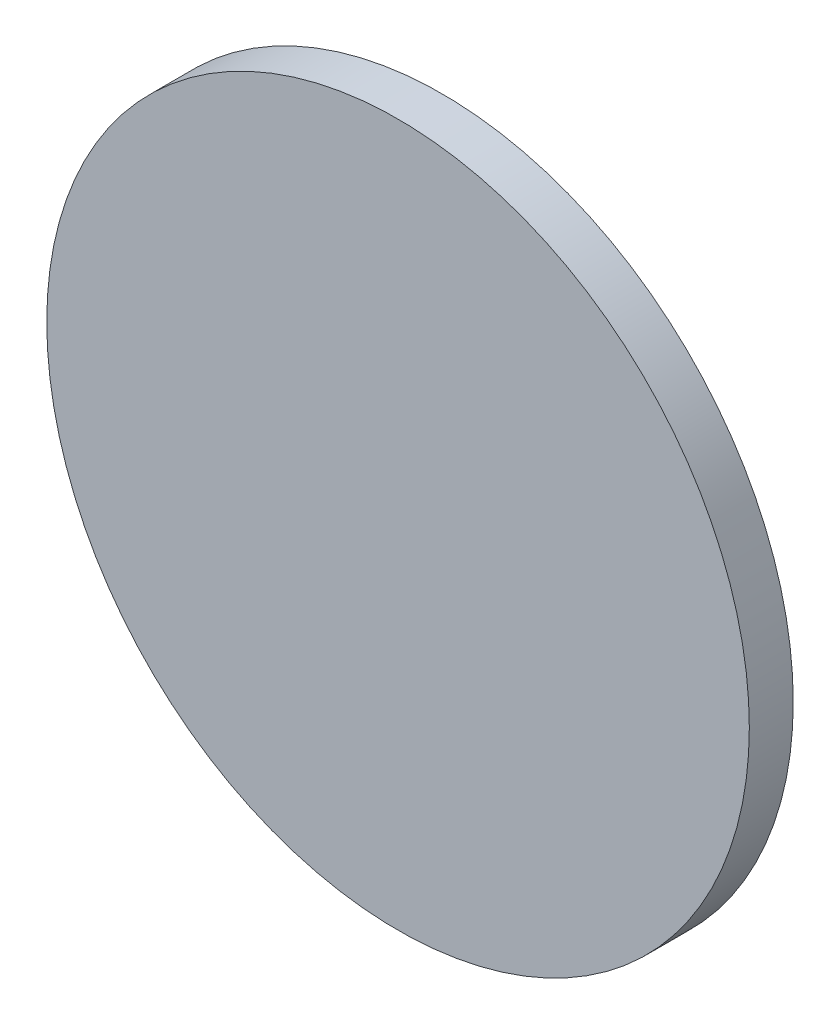
ISO-10303-21;
HEADER;
FILE_DESCRIPTION(('STEP AP214'),'2;1');
FILE_NAME('part.step','',(''),(''),'','','');
FILE_SCHEMA(('AUTOMOTIVE_DESIGN { 1 0 10303 214 1 1 1 1 }'));
ENDSEC;
DATA;
#1=APPLICATION_CONTEXT('core data for automotive mechanical design processes');
#2=APPLICATION_PROTOCOL_DEFINITION('international standard','automotive_design',2000,#1);
#3=PRODUCT_CONTEXT('',#1,'mechanical');
#4=PRODUCT('Part','Part','',(#3));
#5=PRODUCT_RELATED_PRODUCT_CATEGORY('part','',(#4));
#6=PRODUCT_DEFINITION_FORMATION('','',#4);
#7=PRODUCT_DEFINITION_CONTEXT('part definition',#1,'design');
#8=PRODUCT_DEFINITION('design','',#6,#7);
#9=PRODUCT_DEFINITION_SHAPE('','',#8);
#10=(LENGTH_UNIT() NAMED_UNIT(*) SI_UNIT(.MILLI.,.METRE.));
#11=(NAMED_UNIT(*) PLANE_ANGLE_UNIT() SI_UNIT($,.RADIAN.));
#12=(NAMED_UNIT(*) SI_UNIT($,.STERADIAN.) SOLID_ANGLE_UNIT());
#13=UNCERTAINTY_MEASURE_WITH_UNIT(LENGTH_MEASURE(1.E-05),#10,'distance_accuracy_value','');
#14=(GEOMETRIC_REPRESENTATION_CONTEXT(3) GLOBAL_UNCERTAINTY_ASSIGNED_CONTEXT((#13)) GLOBAL_UNIT_ASSIGNED_CONTEXT((#10,
#11,#12)) REPRESENTATION_CONTEXT('',''));
#15=CARTESIAN_POINT('',(0.,0.,0.));
#16=DIRECTION('',(0.,0.,1.));
#17=DIRECTION('',(1.,0.,0.));
#18=AXIS2_PLACEMENT_3D('',#15,#16,#17);
#19=CARTESIAN_POINT('',(0.,0.,6.35));
#20=DIRECTION('',(0.,0.,-1.));
#21=DIRECTION('',(-1.,0.,0.));
#22=AXIS2_PLACEMENT_3D('',#19,#20,#21);
#23=CYLINDRICAL_SURFACE('',#22,50.8);
#24=CARTESIAN_POINT('',(0.,0.,6.35));
#25=DIRECTION('',(0.,0.,1.));
#26=DIRECTION('',(1.,0.,0.));
#27=AXIS2_PLACEMENT_3D('',#24,#25,#26);
#28=CIRCLE('',#27,50.8);
#29=CARTESIAN_POINT('',(50.8,0.,6.35));
#30=VERTEX_POINT('',#29);
#31=EDGE_CURVE('E10',#30,#30,#28,.T.);
#32=ORIENTED_EDGE('',*,*,#31,.F.);
#33=EDGE_LOOP('',(#32));
#34=FACE_BOUND('',#33,.T.);
#35=CARTESIAN_POINT('',(0.,0.,0.));
#36=DIRECTION('',(0.,0.,1.));
#37=DIRECTION('',(1.,0.,0.));
#38=AXIS2_PLACEMENT_3D('',#35,#36,#37);
#39=CIRCLE('',#38,50.8);
#40=CARTESIAN_POINT('',(50.8,0.,0.));
#41=VERTEX_POINT('',#40);
#42=EDGE_CURVE('E44',#41,#41,#39,.T.);
#43=ORIENTED_EDGE('',*,*,#42,.T.);
#44=EDGE_LOOP('',(#43));
#45=FACE_BOUND('',#44,.T.);
#46=ADVANCED_FACE('F41',(#34,#45),#23,.T.);
#47=CARTESIAN_POINT('',(0.,0.,6.35));
#48=DIRECTION('',(0.,0.,1.));
#49=DIRECTION('',(1.,0.,0.));
#50=AXIS2_PLACEMENT_3D('',#47,#48,#49);
#51=PLANE('',#50);
#52=ORIENTED_EDGE('',*,*,#31,.T.);
#53=EDGE_LOOP('',(#52));
#54=FACE_BOUND('',#53,.T.);
#55=ADVANCED_FACE('F58',(#54),#51,.T.);
#56=CARTESIAN_POINT('',(0.,0.,0.));
#57=DIRECTION('',(0.,0.,1.));
#58=DIRECTION('',(1.,0.,0.));
#59=AXIS2_PLACEMENT_3D('',#56,#57,#58);
#60=PLANE('',#59);
#61=ORIENTED_EDGE('',*,*,#42,.F.);
#62=EDGE_LOOP('',(#61));
#63=FACE_BOUND('',#62,.T.);
#64=ADVANCED_FACE('F56',(#63),#60,.F.);
#65=CLOSED_SHELL('',(#46,#55,#64));
#66=MANIFOLD_SOLID_BREP('B2',#65);
#67=ADVANCED_BREP_SHAPE_REPRESENTATION('',(#18,#66),#14);
#68=SHAPE_DEFINITION_REPRESENTATION(#9,#67);
ENDSEC;
END-ISO-10303-21;
